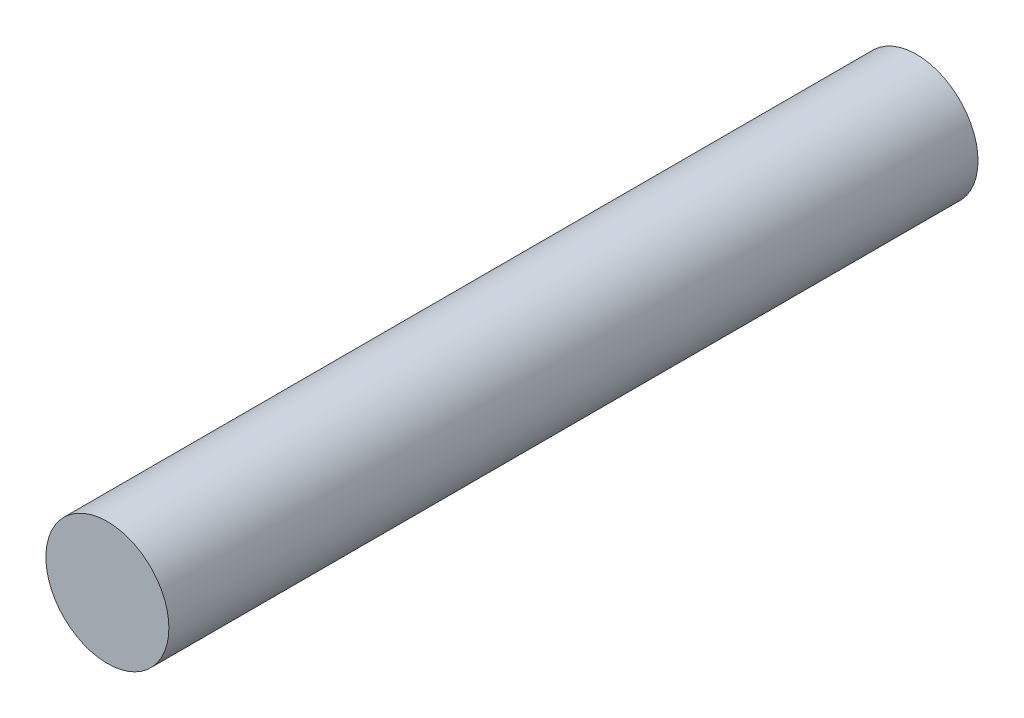
ISO-10303-21;
HEADER;
FILE_DESCRIPTION(('STEP AP214'),'2;1');
FILE_NAME('part.step','',(''),(''),'','','');
FILE_SCHEMA(('AUTOMOTIVE_DESIGN { 1 0 10303 214 1 1 1 1 }'));
ENDSEC;
DATA;
#1=APPLICATION_CONTEXT('core data for automotive mechanical design processes');
#2=APPLICATION_PROTOCOL_DEFINITION('international standard','automotive_design',2000,#1);
#3=PRODUCT_CONTEXT('',#1,'mechanical');
#4=PRODUCT('Part','Part','',(#3));
#5=PRODUCT_RELATED_PRODUCT_CATEGORY('part','',(#4));
#6=PRODUCT_DEFINITION_FORMATION('','',#4);
#7=PRODUCT_DEFINITION_CONTEXT('part definition',#1,'design');
#8=PRODUCT_DEFINITION('design','',#6,#7);
#9=PRODUCT_DEFINITION_SHAPE('','',#8);
#10=(LENGTH_UNIT() NAMED_UNIT(*) SI_UNIT(.MILLI.,.METRE.));
#11=(NAMED_UNIT(*) PLANE_ANGLE_UNIT() SI_UNIT($,.RADIAN.));
#12=(NAMED_UNIT(*) SI_UNIT($,.STERADIAN.) SOLID_ANGLE_UNIT());
#13=UNCERTAINTY_MEASURE_WITH_UNIT(LENGTH_MEASURE(1.E-05),#10,'distance_accuracy_value','');
#14=(GEOMETRIC_REPRESENTATION_CONTEXT(3) GLOBAL_UNCERTAINTY_ASSIGNED_CONTEXT((#13)) GLOBAL_UNIT_ASSIGNED_CONTEXT((#10,
#11,#12)) REPRESENTATION_CONTEXT('',''));
#15=CARTESIAN_POINT('',(0.,0.,0.));
#16=DIRECTION('',(0.,0.,1.));
#17=DIRECTION('',(1.,0.,0.));
#18=AXIS2_PLACEMENT_3D('',#15,#16,#17);
#19=CARTESIAN_POINT('',(0.,0.,12.5));
#20=DIRECTION('',(0.,0.,-1.));
#21=DIRECTION('',(-1.,0.,0.));
#22=AXIS2_PLACEMENT_3D('',#19,#20,#21);
#23=CYLINDRICAL_SURFACE('',#22,1.9);
#24=CARTESIAN_POINT('',(0.,0.,12.5));
#25=DIRECTION('',(0.,0.,1.));
#26=DIRECTION('',(1.,0.,0.));
#27=AXIS2_PLACEMENT_3D('',#24,#25,#26);
#28=CIRCLE('',#27,1.9);
#29=CARTESIAN_POINT('',(1.9,0.,12.5));
#30=VERTEX_POINT('',#29);
#31=EDGE_CURVE('E10',#30,#30,#28,.T.);
#32=ORIENTED_EDGE('',*,*,#31,.F.);
#33=EDGE_LOOP('',(#32));
#34=FACE_BOUND('',#33,.T.);
#35=CARTESIAN_POINT('',(0.,0.,-12.5));
#36=DIRECTION('',(0.,0.,1.));
#37=DIRECTION('',(1.,0.,0.));
#38=AXIS2_PLACEMENT_3D('',#35,#36,#37);
#39=CIRCLE('',#38,1.9);
#40=CARTESIAN_POINT('',(1.9,0.,-12.5));
#41=VERTEX_POINT('',#40);
#42=EDGE_CURVE('E35',#41,#41,#39,.T.);
#43=ORIENTED_EDGE('',*,*,#42,.T.);
#44=EDGE_LOOP('',(#43));
#45=FACE_BOUND('',#44,.T.);
#46=ADVANCED_FACE('F32',(#34,#45),#23,.T.);
#47=CARTESIAN_POINT('',(0.,0.,12.5));
#48=DIRECTION('',(0.,0.,1.));
#49=DIRECTION('',(1.,0.,0.));
#50=AXIS2_PLACEMENT_3D('',#47,#48,#49);
#51=PLANE('',#50);
#52=ORIENTED_EDGE('',*,*,#31,.T.);
#53=EDGE_LOOP('',(#52));
#54=FACE_BOUND('',#53,.T.);
#55=ADVANCED_FACE('F47',(#54),#51,.T.);
#56=CARTESIAN_POINT('',(0.,0.,-12.5));
#57=DIRECTION('',(0.,0.,1.));
#58=DIRECTION('',(1.,0.,0.));
#59=AXIS2_PLACEMENT_3D('',#56,#57,#58);
#60=PLANE('',#59);
#61=ORIENTED_EDGE('',*,*,#42,.F.);
#62=EDGE_LOOP('',(#61));
#63=FACE_BOUND('',#62,.T.);
#64=ADVANCED_FACE('F45',(#63),#60,.F.);
#65=CLOSED_SHELL('',(#46,#55,#64));
#66=MANIFOLD_SOLID_BREP('B2',#65);
#67=ADVANCED_BREP_SHAPE_REPRESENTATION('',(#18,#66),#14);
#68=SHAPE_DEFINITION_REPRESENTATION(#9,#67);
ENDSEC;
END-ISO-10303-21;
